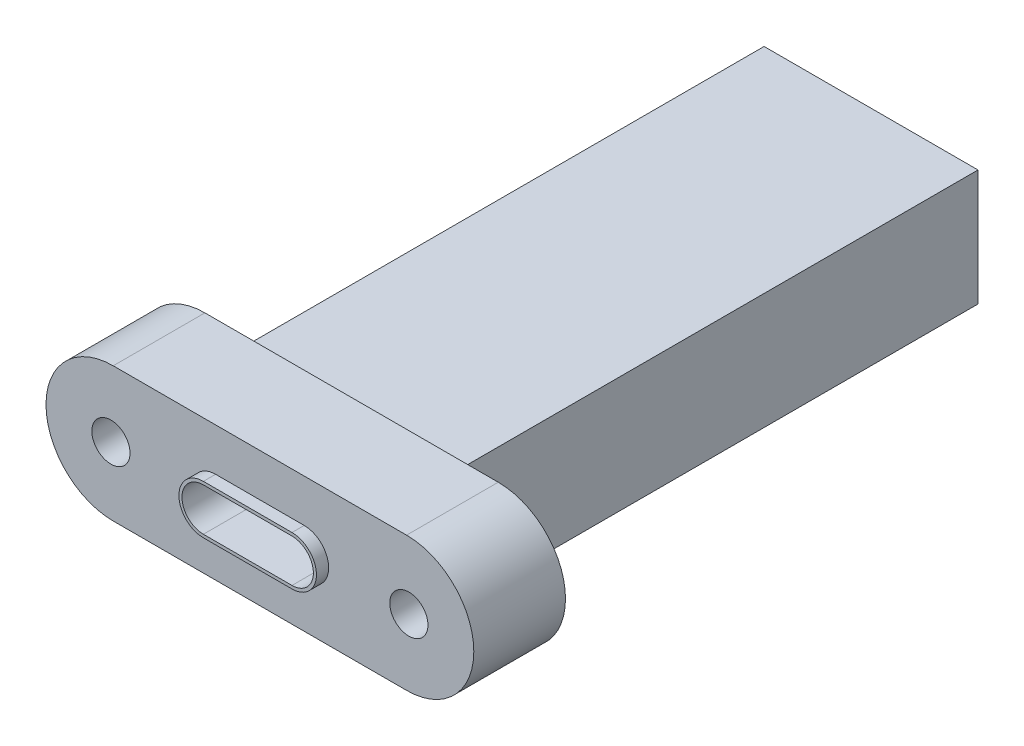
ISO-10303-21;
HEADER;
FILE_DESCRIPTION(('STEP AP214'),'2;1');
FILE_NAME('part.step','',(''),(''),'','','');
FILE_SCHEMA(('AUTOMOTIVE_DESIGN { 1 0 10303 214 1 1 1 1 }'));
ENDSEC;
DATA;
#1=APPLICATION_CONTEXT('core data for automotive mechanical design processes');
#2=APPLICATION_PROTOCOL_DEFINITION('international standard','automotive_design',2000,#1);
#3=PRODUCT_CONTEXT('',#1,'mechanical');
#4=PRODUCT('Part','Part','',(#3));
#5=PRODUCT_RELATED_PRODUCT_CATEGORY('part','',(#4));
#6=PRODUCT_DEFINITION_FORMATION('','',#4);
#7=PRODUCT_DEFINITION_CONTEXT('part definition',#1,'design');
#8=PRODUCT_DEFINITION('design','',#6,#7);
#9=PRODUCT_DEFINITION_SHAPE('','',#8);
#10=(LENGTH_UNIT() NAMED_UNIT(*) SI_UNIT(.MILLI.,.METRE.));
#11=(NAMED_UNIT(*) PLANE_ANGLE_UNIT() SI_UNIT($,.RADIAN.));
#12=(NAMED_UNIT(*) SI_UNIT($,.STERADIAN.) SOLID_ANGLE_UNIT());
#13=UNCERTAINTY_MEASURE_WITH_UNIT(LENGTH_MEASURE(1.E-05),#10,'distance_accuracy_value','');
#14=(GEOMETRIC_REPRESENTATION_CONTEXT(3) GLOBAL_UNCERTAINTY_ASSIGNED_CONTEXT((#13)) GLOBAL_UNIT_ASSIGNED_CONTEXT((#10,
#11,#12)) REPRESENTATION_CONTEXT('',''));
#15=CARTESIAN_POINT('',(0.,0.,0.));
#16=DIRECTION('',(0.,0.,1.));
#17=DIRECTION('',(1.,0.,0.));
#18=AXIS2_PLACEMENT_3D('',#15,#16,#17);
#19=CARTESIAN_POINT('',(-9.6,0.,40.));
#20=DIRECTION('',(0.,0.,1.));
#21=DIRECTION('',(1.,0.,0.));
#22=AXIS2_PLACEMENT_3D('',#19,#20,#21);
#23=PLANE('',#22);
#24=CARTESIAN_POINT('',(-9.75,0.,40.));
#25=DIRECTION('',(0.,0.,1.));
#26=DIRECTION('',(1.,0.,0.));
#27=AXIS2_PLACEMENT_3D('',#24,#25,#26);
#28=CIRCLE('',#27,1.24999999999999);
#29=CARTESIAN_POINT('',(-8.50000000000001,0.,40.));
#30=VERTEX_POINT('',#29);
#31=EDGE_CURVE('E285',#30,#30,#28,.T.);
#32=ORIENTED_EDGE('',*,*,#31,.F.);
#33=EDGE_LOOP('',(#32));
#34=FACE_BOUND('',#33,.T.);
#35=CARTESIAN_POINT('',(9.75,0.,40.));
#36=DIRECTION('',(0.,0.,1.));
#37=DIRECTION('',(1.,0.,0.));
#38=AXIS2_PLACEMENT_3D('',#35,#36,#37);
#39=CIRCLE('',#38,1.24999999999999);
#40=CARTESIAN_POINT('',(11.,0.,40.));
#41=VERTEX_POINT('',#40);
#42=EDGE_CURVE('E177',#41,#41,#39,.T.);
#43=ORIENTED_EDGE('',*,*,#42,.F.);
#44=EDGE_LOOP('',(#43));
#45=FACE_BOUND('',#44,.T.);
#46=CARTESIAN_POINT('',(-9.6,0.,40.));
#47=DIRECTION('',(0.,0.,1.));
#48=DIRECTION('',(1.,0.,0.));
#49=AXIS2_PLACEMENT_3D('',#46,#47,#48);
#50=CIRCLE('',#49,4.4);
#51=CARTESIAN_POINT('',(-9.6,4.4,40.));
#52=VERTEX_POINT('',#51);
#53=CARTESIAN_POINT('',(-9.6,-4.4,40.));
#54=VERTEX_POINT('',#53);
#55=EDGE_CURVE('E221',#52,#54,#50,.T.);
#56=ORIENTED_EDGE('',*,*,#55,.T.);
#57=DIRECTION('',(1.,0.,0.));
#58=VECTOR('',#57,1.);
#59=CARTESIAN_POINT('',(-9.6,-4.4,40.));
#60=LINE('',#59,#58);
#61=CARTESIAN_POINT('',(9.6,-4.4,40.));
#62=VERTEX_POINT('',#61);
#63=EDGE_CURVE('E224',#54,#62,#60,.T.);
#64=ORIENTED_EDGE('',*,*,#63,.T.);
#65=CARTESIAN_POINT('',(9.6,0.,40.));
#66=DIRECTION('',(0.,0.,1.));
#67=DIRECTION('',(1.,0.,0.));
#68=AXIS2_PLACEMENT_3D('',#65,#66,#67);
#69=CIRCLE('',#68,4.4);
#70=CARTESIAN_POINT('',(9.6,4.4,40.));
#71=VERTEX_POINT('',#70);
#72=EDGE_CURVE('E227',#62,#71,#69,.T.);
#73=ORIENTED_EDGE('',*,*,#72,.T.);
#74=DIRECTION('',(-1.,0.,0.));
#75=VECTOR('',#74,1.);
#76=CARTESIAN_POINT('',(-9.6,4.4,40.));
#77=LINE('',#76,#75);
#78=EDGE_CURVE('E229',#71,#52,#77,.T.);
#79=ORIENTED_EDGE('',*,*,#78,.T.);
#80=EDGE_LOOP('',(#56,#64,#73,#79));
#81=FACE_BOUND('',#80,.T.);
#82=DIRECTION('',(1.,0.,0.));
#83=VECTOR('',#82,1.);
#84=CARTESIAN_POINT('',(-2.9,-1.6,40.));
#85=LINE('',#84,#83);
#86=CARTESIAN_POINT('',(-2.9,-1.6,40.));
#87=VERTEX_POINT('',#86);
#88=CARTESIAN_POINT('',(2.9,-1.6,40.));
#89=VERTEX_POINT('',#88);
#90=EDGE_CURVE('E207',#87,#89,#85,.T.);
#91=ORIENTED_EDGE('',*,*,#90,.F.);
#92=CARTESIAN_POINT('',(-2.9,0.,40.));
#93=DIRECTION('',(0.,0.,1.));
#94=DIRECTION('',(1.,0.,0.));
#95=AXIS2_PLACEMENT_3D('',#92,#93,#94);
#96=CIRCLE('',#95,1.6);
#97=CARTESIAN_POINT('',(-2.9,1.6,40.));
#98=VERTEX_POINT('',#97);
#99=EDGE_CURVE('E190',#98,#87,#96,.T.);
#100=ORIENTED_EDGE('',*,*,#99,.F.);
#101=DIRECTION('',(-1.,0.,0.));
#102=VECTOR('',#101,1.);
#103=CARTESIAN_POINT('',(-2.9,1.6,40.));
#104=LINE('',#103,#102);
#105=CARTESIAN_POINT('',(2.9,1.6,40.));
#106=VERTEX_POINT('',#105);
#107=EDGE_CURVE('E198',#106,#98,#104,.T.);
#108=ORIENTED_EDGE('',*,*,#107,.F.);
#109=CARTESIAN_POINT('',(2.9,0.,40.));
#110=DIRECTION('',(0.,0.,1.));
#111=DIRECTION('',(1.,0.,0.));
#112=AXIS2_PLACEMENT_3D('',#109,#110,#111);
#113=CIRCLE('',#112,1.6);
#114=EDGE_CURVE('E209',#89,#106,#113,.T.);
#115=ORIENTED_EDGE('',*,*,#114,.F.);
#116=EDGE_LOOP('',(#91,#100,#108,#115));
#117=FACE_BOUND('',#116,.T.);
#118=ADVANCED_FACE('F35',(#34,#45,#81,#117),#23,.T.);
#119=CARTESIAN_POINT('',(7.,-3.8,34.));
#120=DIRECTION('',(-1.,0.,0.));
#121=DIRECTION('',(0.,0.,1.));
#122=AXIS2_PLACEMENT_3D('',#119,#120,#121);
#123=PLANE('',#122);
#124=DIRECTION('',(0.,1.,0.));
#125=VECTOR('',#124,1.);
#126=CARTESIAN_POINT('',(7.,-3.8,0.));
#127=LINE('',#126,#125);
#128=CARTESIAN_POINT('',(7.,-3.8,0.));
#129=VERTEX_POINT('',#128);
#130=CARTESIAN_POINT('',(7.,3.8,0.));
#131=VERTEX_POINT('',#130);
#132=EDGE_CURVE('E250',#129,#131,#127,.T.);
#133=ORIENTED_EDGE('',*,*,#132,.T.);
#134=DIRECTION('',(0.,0.,-1.));
#135=VECTOR('',#134,1.);
#136=CARTESIAN_POINT('',(7.,3.8,34.));
#137=LINE('',#136,#135);
#138=CARTESIAN_POINT('',(7.,3.8,34.));
#139=VERTEX_POINT('',#138);
#140=EDGE_CURVE('E11',#139,#131,#137,.T.);
#141=ORIENTED_EDGE('',*,*,#140,.F.);
#142=DIRECTION('',(0.,1.,0.));
#143=VECTOR('',#142,1.);
#144=CARTESIAN_POINT('',(7.,-3.8,34.));
#145=LINE('',#144,#143);
#146=CARTESIAN_POINT('',(7.,-3.8,34.));
#147=VERTEX_POINT('',#146);
#148=EDGE_CURVE('E251',#147,#139,#145,.T.);
#149=ORIENTED_EDGE('',*,*,#148,.F.);
#150=DIRECTION('',(0.,0.,-1.));
#151=VECTOR('',#150,1.);
#152=CARTESIAN_POINT('',(7.,-3.8,34.));
#153=LINE('',#152,#151);
#154=EDGE_CURVE('E264',#147,#129,#153,.T.);
#155=ORIENTED_EDGE('',*,*,#154,.T.);
#156=EDGE_LOOP('',(#133,#141,#149,#155));
#157=FACE_BOUND('',#156,.T.);
#158=ADVANCED_FACE('F37',(#157),#123,.F.);
#159=CARTESIAN_POINT('',(-7.,3.8,34.));
#160=DIRECTION('',(0.,-1.,0.));
#161=DIRECTION('',(0.,0.,-1.));
#162=AXIS2_PLACEMENT_3D('',#159,#160,#161);
#163=PLANE('',#162);
#164=DIRECTION('',(-1.,0.,0.));
#165=VECTOR('',#164,1.);
#166=CARTESIAN_POINT('',(-7.,3.8,0.));
#167=LINE('',#166,#165);
#168=CARTESIAN_POINT('',(-7.,3.8,0.));
#169=VERTEX_POINT('',#168);
#170=EDGE_CURVE('E267',#131,#169,#167,.T.);
#171=ORIENTED_EDGE('',*,*,#170,.T.);
#172=DIRECTION('',(0.,0.,-1.));
#173=VECTOR('',#172,1.);
#174=CARTESIAN_POINT('',(-7.,3.8,34.));
#175=LINE('',#174,#173);
#176=CARTESIAN_POINT('',(-7.,3.8,34.));
#177=VERTEX_POINT('',#176);
#178=EDGE_CURVE('E44',#177,#169,#175,.T.);
#179=ORIENTED_EDGE('',*,*,#178,.F.);
#180=DIRECTION('',(-1.,0.,0.));
#181=VECTOR('',#180,1.);
#182=CARTESIAN_POINT('',(-7.,3.8,34.));
#183=LINE('',#182,#181);
#184=EDGE_CURVE('E254',#139,#177,#183,.T.);
#185=ORIENTED_EDGE('',*,*,#184,.F.);
#186=ORIENTED_EDGE('',*,*,#140,.T.);
#187=EDGE_LOOP('',(#171,#179,#185,#186));
#188=FACE_BOUND('',#187,.T.);
#189=ADVANCED_FACE('F363',(#188),#163,.F.);
#190=CARTESIAN_POINT('',(-7.,-3.8,34.));
#191=DIRECTION('',(1.,0.,0.));
#192=DIRECTION('',(0.,0.,-1.));
#193=AXIS2_PLACEMENT_3D('',#190,#191,#192);
#194=PLANE('',#193);
#195=DIRECTION('',(0.,-1.,0.));
#196=VECTOR('',#195,1.);
#197=CARTESIAN_POINT('',(-7.,-3.8,0.));
#198=LINE('',#197,#196);
#199=CARTESIAN_POINT('',(-7.,-3.8,0.));
#200=VERTEX_POINT('',#199);
#201=EDGE_CURVE('E269',#169,#200,#198,.T.);
#202=ORIENTED_EDGE('',*,*,#201,.T.);
#203=DIRECTION('',(0.,0.,-1.));
#204=VECTOR('',#203,1.);
#205=CARTESIAN_POINT('',(-7.,-3.8,34.));
#206=LINE('',#205,#204);
#207=CARTESIAN_POINT('',(-7.,-3.8,34.));
#208=VERTEX_POINT('',#207);
#209=EDGE_CURVE('E274',#208,#200,#206,.T.);
#210=ORIENTED_EDGE('',*,*,#209,.F.);
#211=DIRECTION('',(0.,-1.,0.));
#212=VECTOR('',#211,1.);
#213=CARTESIAN_POINT('',(-7.,-3.8,34.));
#214=LINE('',#213,#212);
#215=EDGE_CURVE('E258',#177,#208,#214,.T.);
#216=ORIENTED_EDGE('',*,*,#215,.F.);
#217=ORIENTED_EDGE('',*,*,#178,.T.);
#218=EDGE_LOOP('',(#202,#210,#216,#217));
#219=FACE_BOUND('',#218,.T.);
#220=ADVANCED_FACE('F360',(#219),#194,.F.);
#221=CARTESIAN_POINT('',(-7.,-3.8,34.));
#222=DIRECTION('',(0.,1.,0.));
#223=DIRECTION('',(0.,0.,1.));
#224=AXIS2_PLACEMENT_3D('',#221,#222,#223);
#225=PLANE('',#224);
#226=DIRECTION('',(1.,0.,0.));
#227=VECTOR('',#226,1.);
#228=CARTESIAN_POINT('',(-7.,-3.8,0.));
#229=LINE('',#228,#227);
#230=EDGE_CURVE('E255',#200,#129,#229,.T.);
#231=ORIENTED_EDGE('',*,*,#230,.T.);
#232=ORIENTED_EDGE('',*,*,#154,.F.);
#233=DIRECTION('',(1.,0.,0.));
#234=VECTOR('',#233,1.);
#235=CARTESIAN_POINT('',(-7.,-3.8,34.));
#236=LINE('',#235,#234);
#237=EDGE_CURVE('E261',#208,#147,#236,.T.);
#238=ORIENTED_EDGE('',*,*,#237,.F.);
#239=ORIENTED_EDGE('',*,*,#209,.T.);
#240=EDGE_LOOP('',(#231,#232,#238,#239));
#241=FACE_BOUND('',#240,.T.);
#242=ADVANCED_FACE('F356',(#241),#225,.F.);
#243=CARTESIAN_POINT('',(0.,0.,0.));
#244=DIRECTION('',(0.,0.,-1.));
#245=DIRECTION('',(-1.,0.,0.));
#246=AXIS2_PLACEMENT_3D('',#243,#244,#245);
#247=PLANE('',#246);
#248=ORIENTED_EDGE('',*,*,#132,.F.);
#249=ORIENTED_EDGE('',*,*,#230,.F.);
#250=ORIENTED_EDGE('',*,*,#201,.F.);
#251=ORIENTED_EDGE('',*,*,#170,.F.);
#252=EDGE_LOOP('',(#248,#249,#250,#251));
#253=FACE_BOUND('',#252,.T.);
#254=ADVANCED_FACE('F339',(#253),#247,.T.);
#255=CARTESIAN_POINT('',(-9.6,0.,34.));
#256=DIRECTION('',(0.,0.,1.));
#257=DIRECTION('',(1.,0.,0.));
#258=AXIS2_PLACEMENT_3D('',#255,#256,#257);
#259=PLANE('',#258);
#260=CARTESIAN_POINT('',(-9.75,0.,34.));
#261=DIRECTION('',(0.,0.,1.));
#262=DIRECTION('',(1.,0.,0.));
#263=AXIS2_PLACEMENT_3D('',#260,#261,#262);
#264=CIRCLE('',#263,1.24999999999999);
#265=CARTESIAN_POINT('',(-8.50000000000001,0.,34.));
#266=VERTEX_POINT('',#265);
#267=EDGE_CURVE('E39',#266,#266,#264,.T.);
#268=ORIENTED_EDGE('',*,*,#267,.T.);
#269=EDGE_LOOP('',(#268));
#270=FACE_BOUND('',#269,.T.);
#271=CARTESIAN_POINT('',(9.75,0.,34.));
#272=DIRECTION('',(0.,0.,1.));
#273=DIRECTION('',(1.,0.,0.));
#274=AXIS2_PLACEMENT_3D('',#271,#272,#273);
#275=CIRCLE('',#274,1.24999999999999);
#276=CARTESIAN_POINT('',(11.,0.,34.));
#277=VERTEX_POINT('',#276);
#278=EDGE_CURVE('E184',#277,#277,#275,.T.);
#279=ORIENTED_EDGE('',*,*,#278,.T.);
#280=EDGE_LOOP('',(#279));
#281=FACE_BOUND('',#280,.T.);
#282=CARTESIAN_POINT('',(-9.6,0.,34.));
#283=DIRECTION('',(0.,0.,1.));
#284=DIRECTION('',(1.,0.,0.));
#285=AXIS2_PLACEMENT_3D('',#282,#283,#284);
#286=CIRCLE('',#285,4.4);
#287=CARTESIAN_POINT('',(-9.6,4.4,34.));
#288=VERTEX_POINT('',#287);
#289=CARTESIAN_POINT('',(-9.6,-4.4,34.));
#290=VERTEX_POINT('',#289);
#291=EDGE_CURVE('E220',#288,#290,#286,.T.);
#292=ORIENTED_EDGE('',*,*,#291,.F.);
#293=DIRECTION('',(-1.,0.,0.));
#294=VECTOR('',#293,1.);
#295=CARTESIAN_POINT('',(-9.6,4.4,34.));
#296=LINE('',#295,#294);
#297=CARTESIAN_POINT('',(9.6,4.4,34.));
#298=VERTEX_POINT('',#297);
#299=EDGE_CURVE('E225',#298,#288,#296,.T.);
#300=ORIENTED_EDGE('',*,*,#299,.F.);
#301=CARTESIAN_POINT('',(9.6,0.,34.));
#302=DIRECTION('',(0.,0.,1.));
#303=DIRECTION('',(1.,0.,0.));
#304=AXIS2_PLACEMENT_3D('',#301,#302,#303);
#305=CIRCLE('',#304,4.4);
#306=CARTESIAN_POINT('',(9.6,-4.4,34.));
#307=VERTEX_POINT('',#306);
#308=EDGE_CURVE('E236',#307,#298,#305,.T.);
#309=ORIENTED_EDGE('',*,*,#308,.F.);
#310=DIRECTION('',(1.,0.,0.));
#311=VECTOR('',#310,1.);
#312=CARTESIAN_POINT('',(-9.6,-4.4,34.));
#313=LINE('',#312,#311);
#314=EDGE_CURVE('E234',#290,#307,#313,.T.);
#315=ORIENTED_EDGE('',*,*,#314,.F.);
#316=EDGE_LOOP('',(#292,#300,#309,#315));
#317=FACE_BOUND('',#316,.T.);
#318=ORIENTED_EDGE('',*,*,#237,.T.);
#319=ORIENTED_EDGE('',*,*,#148,.T.);
#320=ORIENTED_EDGE('',*,*,#184,.T.);
#321=ORIENTED_EDGE('',*,*,#215,.T.);
#322=EDGE_LOOP('',(#318,#319,#320,#321));
#323=FACE_BOUND('',#322,.T.);
#324=ADVANCED_FACE('F335',(#270,#281,#317,#323),#259,.F.);
#325=CARTESIAN_POINT('',(-9.6,0.,40.));
#326=DIRECTION('',(0.,0.,-1.));
#327=DIRECTION('',(-1.,0.,0.));
#328=AXIS2_PLACEMENT_3D('',#325,#326,#327);
#329=CYLINDRICAL_SURFACE('',#328,4.4);
#330=ORIENTED_EDGE('',*,*,#291,.T.);
#331=DIRECTION('',(0.,0.,-1.));
#332=VECTOR('',#331,1.);
#333=CARTESIAN_POINT('',(-9.6,-4.4,40.));
#334=LINE('',#333,#332);
#335=EDGE_CURVE('E247',#54,#290,#334,.T.);
#336=ORIENTED_EDGE('',*,*,#335,.F.);
#337=ORIENTED_EDGE('',*,*,#55,.F.);
#338=DIRECTION('',(0.,0.,-1.));
#339=VECTOR('',#338,1.);
#340=CARTESIAN_POINT('',(-9.6,4.4,40.));
#341=LINE('',#340,#339);
#342=EDGE_CURVE('E231',#52,#288,#341,.T.);
#343=ORIENTED_EDGE('',*,*,#342,.T.);
#344=EDGE_LOOP('',(#330,#336,#337,#343));
#345=FACE_BOUND('',#344,.T.);
#346=ADVANCED_FACE('F338',(#345),#329,.T.);
#347=CARTESIAN_POINT('',(-9.6,-4.4,40.));
#348=DIRECTION('',(0.,1.,0.));
#349=DIRECTION('',(0.,0.,1.));
#350=AXIS2_PLACEMENT_3D('',#347,#348,#349);
#351=PLANE('',#350);
#352=ORIENTED_EDGE('',*,*,#314,.T.);
#353=DIRECTION('',(0.,0.,-1.));
#354=VECTOR('',#353,1.);
#355=CARTESIAN_POINT('',(9.6,-4.4,40.));
#356=LINE('',#355,#354);
#357=EDGE_CURVE('E244',#62,#307,#356,.T.);
#358=ORIENTED_EDGE('',*,*,#357,.F.);
#359=ORIENTED_EDGE('',*,*,#63,.F.);
#360=ORIENTED_EDGE('',*,*,#335,.T.);
#361=EDGE_LOOP('',(#352,#358,#359,#360));
#362=FACE_BOUND('',#361,.T.);
#363=ADVANCED_FACE('F346',(#362),#351,.F.);
#364=CARTESIAN_POINT('',(9.6,0.,40.));
#365=DIRECTION('',(0.,0.,-1.));
#366=DIRECTION('',(-1.,0.,0.));
#367=AXIS2_PLACEMENT_3D('',#364,#365,#366);
#368=CYLINDRICAL_SURFACE('',#367,4.4);
#369=ORIENTED_EDGE('',*,*,#308,.T.);
#370=DIRECTION('',(0.,0.,-1.));
#371=VECTOR('',#370,1.);
#372=CARTESIAN_POINT('',(9.6,4.4,40.));
#373=LINE('',#372,#371);
#374=EDGE_CURVE('E241',#71,#298,#373,.T.);
#375=ORIENTED_EDGE('',*,*,#374,.F.);
#376=ORIENTED_EDGE('',*,*,#72,.F.);
#377=ORIENTED_EDGE('',*,*,#357,.T.);
#378=EDGE_LOOP('',(#369,#375,#376,#377));
#379=FACE_BOUND('',#378,.T.);
#380=ADVANCED_FACE('F342',(#379),#368,.T.);
#381=CARTESIAN_POINT('',(-9.6,4.4,40.));
#382=DIRECTION('',(0.,-1.,0.));
#383=DIRECTION('',(0.,0.,-1.));
#384=AXIS2_PLACEMENT_3D('',#381,#382,#383);
#385=PLANE('',#384);
#386=ORIENTED_EDGE('',*,*,#299,.T.);
#387=ORIENTED_EDGE('',*,*,#342,.F.);
#388=ORIENTED_EDGE('',*,*,#78,.F.);
#389=ORIENTED_EDGE('',*,*,#374,.T.);
#390=EDGE_LOOP('',(#386,#387,#388,#389));
#391=FACE_BOUND('',#390,.T.);
#392=ADVANCED_FACE('F333',(#391),#385,.F.);
#393=CARTESIAN_POINT('',(-2.9,0.,40.8));
#394=DIRECTION('',(0.,0.,-1.));
#395=DIRECTION('',(-1.,0.,0.));
#396=AXIS2_PLACEMENT_3D('',#393,#394,#395);
#397=CYLINDRICAL_SURFACE('',#396,1.6);
#398=ORIENTED_EDGE('',*,*,#99,.T.);
#399=DIRECTION('',(0.,0.,-1.));
#400=VECTOR('',#399,1.);
#401=CARTESIAN_POINT('',(-2.9,-1.6,40.8));
#402=LINE('',#401,#400);
#403=CARTESIAN_POINT('',(-2.9,-1.6,40.8));
#404=VERTEX_POINT('',#403);
#405=EDGE_CURVE('E218',#404,#87,#402,.T.);
#406=ORIENTED_EDGE('',*,*,#405,.F.);
#407=CARTESIAN_POINT('',(-2.9,0.,40.8));
#408=DIRECTION('',(0.,0.,1.));
#409=DIRECTION('',(1.,0.,0.));
#410=AXIS2_PLACEMENT_3D('',#407,#408,#409);
#411=CIRCLE('',#410,1.6);
#412=CARTESIAN_POINT('',(-2.9,1.6,40.8));
#413=VERTEX_POINT('',#412);
#414=EDGE_CURVE('E194',#413,#404,#411,.T.);
#415=ORIENTED_EDGE('',*,*,#414,.F.);
#416=DIRECTION('',(0.,0.,-1.));
#417=VECTOR('',#416,1.);
#418=CARTESIAN_POINT('',(-2.9,1.6,40.8));
#419=LINE('',#418,#417);
#420=EDGE_CURVE('E204',#413,#98,#419,.T.);
#421=ORIENTED_EDGE('',*,*,#420,.T.);
#422=EDGE_LOOP('',(#398,#406,#415,#421));
#423=FACE_BOUND('',#422,.T.);
#424=ADVANCED_FACE('F317',(#423),#397,.T.);
#425=CARTESIAN_POINT('',(-2.9,-1.6,40.8));
#426=DIRECTION('',(0.,1.,0.));
#427=DIRECTION('',(0.,0.,1.));
#428=AXIS2_PLACEMENT_3D('',#425,#426,#427);
#429=PLANE('',#428);
#430=ORIENTED_EDGE('',*,*,#90,.T.);
#431=DIRECTION('',(0.,0.,-1.));
#432=VECTOR('',#431,1.);
#433=CARTESIAN_POINT('',(2.9,-1.6,40.8));
#434=LINE('',#433,#432);
#435=CARTESIAN_POINT('',(2.9,-1.6,40.8));
#436=VERTEX_POINT('',#435);
#437=EDGE_CURVE('E215',#436,#89,#434,.T.);
#438=ORIENTED_EDGE('',*,*,#437,.F.);
#439=DIRECTION('',(1.,0.,0.));
#440=VECTOR('',#439,1.);
#441=CARTESIAN_POINT('',(-2.9,-1.6,40.8));
#442=LINE('',#441,#440);
#443=EDGE_CURVE('E197',#404,#436,#442,.T.);
#444=ORIENTED_EDGE('',*,*,#443,.F.);
#445=ORIENTED_EDGE('',*,*,#405,.T.);
#446=EDGE_LOOP('',(#430,#438,#444,#445));
#447=FACE_BOUND('',#446,.T.);
#448=ADVANCED_FACE('F307',(#447),#429,.F.);
#449=CARTESIAN_POINT('',(2.9,0.,40.8));
#450=DIRECTION('',(0.,0.,-1.));
#451=DIRECTION('',(-1.,0.,0.));
#452=AXIS2_PLACEMENT_3D('',#449,#450,#451);
#453=CYLINDRICAL_SURFACE('',#452,1.6);
#454=ORIENTED_EDGE('',*,*,#114,.T.);
#455=DIRECTION('',(0.,0.,-1.));
#456=VECTOR('',#455,1.);
#457=CARTESIAN_POINT('',(2.9,1.6,40.8));
#458=LINE('',#457,#456);
#459=CARTESIAN_POINT('',(2.9,1.6,40.8));
#460=VERTEX_POINT('',#459);
#461=EDGE_CURVE('E60',#460,#106,#458,.T.);
#462=ORIENTED_EDGE('',*,*,#461,.F.);
#463=CARTESIAN_POINT('',(2.9,0.,40.8));
#464=DIRECTION('',(0.,0.,1.));
#465=DIRECTION('',(1.,0.,0.));
#466=AXIS2_PLACEMENT_3D('',#463,#464,#465);
#467=CIRCLE('',#466,1.6);
#468=EDGE_CURVE('E200',#436,#460,#467,.T.);
#469=ORIENTED_EDGE('',*,*,#468,.F.);
#470=ORIENTED_EDGE('',*,*,#437,.T.);
#471=EDGE_LOOP('',(#454,#462,#469,#470));
#472=FACE_BOUND('',#471,.T.);
#473=ADVANCED_FACE('F311',(#472),#453,.T.);
#474=CARTESIAN_POINT('',(-2.9,1.6,40.8));
#475=DIRECTION('',(0.,-1.,0.));
#476=DIRECTION('',(0.,0.,-1.));
#477=AXIS2_PLACEMENT_3D('',#474,#475,#476);
#478=PLANE('',#477);
#479=ORIENTED_EDGE('',*,*,#107,.T.);
#480=ORIENTED_EDGE('',*,*,#420,.F.);
#481=DIRECTION('',(-1.,0.,0.));
#482=VECTOR('',#481,1.);
#483=CARTESIAN_POINT('',(-2.9,1.6,40.8));
#484=LINE('',#483,#482);
#485=EDGE_CURVE('E202',#460,#413,#484,.T.);
#486=ORIENTED_EDGE('',*,*,#485,.F.);
#487=ORIENTED_EDGE('',*,*,#461,.T.);
#488=EDGE_LOOP('',(#479,#480,#486,#487));
#489=FACE_BOUND('',#488,.T.);
#490=ADVANCED_FACE('F318',(#489),#478,.F.);
#491=CARTESIAN_POINT('',(-2.9,0.,40.8));
#492=DIRECTION('',(0.,0.,1.));
#493=DIRECTION('',(1.,0.,0.));
#494=AXIS2_PLACEMENT_3D('',#491,#492,#493);
#495=PLANE('',#494);
#496=CARTESIAN_POINT('',(-2.9,0.,40.8));
#497=DIRECTION('',(0.,0.,1.));
#498=DIRECTION('',(1.,0.,0.));
#499=AXIS2_PLACEMENT_3D('',#496,#497,#498);
#500=CIRCLE('',#499,1.4);
#501=CARTESIAN_POINT('',(-2.9,1.4,40.8));
#502=VERTEX_POINT('',#501);
#503=CARTESIAN_POINT('',(-2.9,-1.4,40.8));
#504=VERTEX_POINT('',#503);
#505=EDGE_CURVE('E52',#502,#504,#500,.T.);
#506=ORIENTED_EDGE('',*,*,#505,.F.);
#507=DIRECTION('',(-1.,0.,0.));
#508=VECTOR('',#507,1.);
#509=CARTESIAN_POINT('',(2.9,1.4,40.8));
#510=LINE('',#509,#508);
#511=CARTESIAN_POINT('',(2.9,1.4,40.8));
#512=VERTEX_POINT('',#511);
#513=EDGE_CURVE('E171',#512,#502,#510,.T.);
#514=ORIENTED_EDGE('',*,*,#513,.F.);
#515=CARTESIAN_POINT('',(2.9,0.,40.8));
#516=DIRECTION('',(0.,0.,1.));
#517=DIRECTION('',(1.,0.,0.));
#518=AXIS2_PLACEMENT_3D('',#515,#516,#517);
#519=CIRCLE('',#518,1.4);
#520=CARTESIAN_POINT('',(2.9,-1.4,40.8));
#521=VERTEX_POINT('',#520);
#522=EDGE_CURVE('E174',#521,#512,#519,.T.);
#523=ORIENTED_EDGE('',*,*,#522,.F.);
#524=DIRECTION('',(1.,0.,0.));
#525=VECTOR('',#524,1.);
#526=CARTESIAN_POINT('',(-2.9,-1.4,40.8));
#527=LINE('',#526,#525);
#528=EDGE_CURVE('E183',#504,#521,#527,.T.);
#529=ORIENTED_EDGE('',*,*,#528,.F.);
#530=EDGE_LOOP('',(#506,#514,#523,#529));
#531=FACE_BOUND('',#530,.T.);
#532=ORIENTED_EDGE('',*,*,#414,.T.);
#533=ORIENTED_EDGE('',*,*,#443,.T.);
#534=ORIENTED_EDGE('',*,*,#468,.T.);
#535=ORIENTED_EDGE('',*,*,#485,.T.);
#536=EDGE_LOOP('',(#532,#533,#534,#535));
#537=FACE_BOUND('',#536,.T.);
#538=ADVANCED_FACE('F313',(#531,#537),#495,.T.);
#539=CARTESIAN_POINT('',(-2.9,0.,35.8));
#540=DIRECTION('',(0.,0.,1.));
#541=DIRECTION('',(1.,0.,0.));
#542=AXIS2_PLACEMENT_3D('',#539,#540,#541);
#543=CYLINDRICAL_SURFACE('',#542,1.4);
#544=ORIENTED_EDGE('',*,*,#505,.T.);
#545=DIRECTION('',(0.,0.,1.));
#546=VECTOR('',#545,1.);
#547=CARTESIAN_POINT('',(-2.9,-1.4,35.8));
#548=LINE('',#547,#546);
#549=CARTESIAN_POINT('',(-2.9,-1.4,35.8));
#550=VERTEX_POINT('',#549);
#551=EDGE_CURVE('E149',#550,#504,#548,.T.);
#552=ORIENTED_EDGE('',*,*,#551,.F.);
#553=CARTESIAN_POINT('',(-2.9,0.,35.8));
#554=DIRECTION('',(0.,0.,1.));
#555=DIRECTION('',(1.,0.,0.));
#556=AXIS2_PLACEMENT_3D('',#553,#554,#555);
#557=CIRCLE('',#556,1.4);
#558=CARTESIAN_POINT('',(-2.9,1.4,35.8));
#559=VERTEX_POINT('',#558);
#560=EDGE_CURVE('E153',#559,#550,#557,.T.);
#561=ORIENTED_EDGE('',*,*,#560,.F.);
#562=DIRECTION('',(0.,0.,1.));
#563=VECTOR('',#562,1.);
#564=CARTESIAN_POINT('',(-2.9,1.4,35.8));
#565=LINE('',#564,#563);
#566=EDGE_CURVE('E188',#559,#502,#565,.T.);
#567=ORIENTED_EDGE('',*,*,#566,.T.);
#568=EDGE_LOOP('',(#544,#552,#561,#567));
#569=FACE_BOUND('',#568,.T.);
#570=ADVANCED_FACE('F151',(#569),#543,.F.);
#571=CARTESIAN_POINT('',(2.9,1.4,35.8));
#572=DIRECTION('',(0.,1.,0.));
#573=DIRECTION('',(-1.,0.,0.));
#574=AXIS2_PLACEMENT_3D('',#571,#572,#573);
#575=PLANE('',#574);
#576=ORIENTED_EDGE('',*,*,#513,.T.);
#577=ORIENTED_EDGE('',*,*,#566,.F.);
#578=DIRECTION('',(-1.,0.,0.));
#579=VECTOR('',#578,1.);
#580=CARTESIAN_POINT('',(2.9,1.4,35.8));
#581=LINE('',#580,#579);
#582=CARTESIAN_POINT('',(2.9,1.4,35.8));
#583=VERTEX_POINT('',#582);
#584=EDGE_CURVE('E159',#583,#559,#581,.T.);
#585=ORIENTED_EDGE('',*,*,#584,.F.);
#586=DIRECTION('',(0.,0.,1.));
#587=VECTOR('',#586,1.);
#588=CARTESIAN_POINT('',(2.9,1.4,35.8));
#589=LINE('',#588,#587);
#590=EDGE_CURVE('E191',#583,#512,#589,.T.);
#591=ORIENTED_EDGE('',*,*,#590,.T.);
#592=EDGE_LOOP('',(#576,#577,#585,#591));
#593=FACE_BOUND('',#592,.T.);
#594=ADVANCED_FACE('F438',(#593),#575,.F.);
#595=CARTESIAN_POINT('',(2.9,0.,35.8));
#596=DIRECTION('',(0.,0.,1.));
#597=DIRECTION('',(1.,0.,0.));
#598=AXIS2_PLACEMENT_3D('',#595,#596,#597);
#599=CYLINDRICAL_SURFACE('',#598,1.4);
#600=ORIENTED_EDGE('',*,*,#522,.T.);
#601=ORIENTED_EDGE('',*,*,#590,.F.);
#602=CARTESIAN_POINT('',(2.9,0.,35.8));
#603=DIRECTION('',(0.,0.,1.));
#604=DIRECTION('',(1.,0.,0.));
#605=AXIS2_PLACEMENT_3D('',#602,#603,#604);
#606=CIRCLE('',#605,1.4);
#607=CARTESIAN_POINT('',(2.9,-1.4,35.8));
#608=VERTEX_POINT('',#607);
#609=EDGE_CURVE('E167',#608,#583,#606,.T.);
#610=ORIENTED_EDGE('',*,*,#609,.F.);
#611=DIRECTION('',(0.,0.,1.));
#612=VECTOR('',#611,1.);
#613=CARTESIAN_POINT('',(2.9,-1.4,35.8));
#614=LINE('',#613,#612);
#615=EDGE_CURVE('E158',#608,#521,#614,.T.);
#616=ORIENTED_EDGE('',*,*,#615,.T.);
#617=EDGE_LOOP('',(#600,#601,#610,#616));
#618=FACE_BOUND('',#617,.T.);
#619=ADVANCED_FACE('F431',(#618),#599,.F.);
#620=CARTESIAN_POINT('',(-2.9,-1.4,35.8));
#621=DIRECTION('',(0.,-1.,0.));
#622=DIRECTION('',(1.,0.,0.));
#623=AXIS2_PLACEMENT_3D('',#620,#621,#622);
#624=PLANE('',#623);
#625=ORIENTED_EDGE('',*,*,#528,.T.);
#626=ORIENTED_EDGE('',*,*,#615,.F.);
#627=DIRECTION('',(1.,0.,0.));
#628=VECTOR('',#627,1.);
#629=CARTESIAN_POINT('',(-2.9,-1.4,35.8));
#630=LINE('',#629,#628);
#631=EDGE_CURVE('E162',#550,#608,#630,.T.);
#632=ORIENTED_EDGE('',*,*,#631,.F.);
#633=ORIENTED_EDGE('',*,*,#551,.T.);
#634=EDGE_LOOP('',(#625,#626,#632,#633));
#635=FACE_BOUND('',#634,.T.);
#636=ADVANCED_FACE('F163',(#635),#624,.F.);
#637=CARTESIAN_POINT('',(-2.9,0.,35.8));
#638=DIRECTION('',(0.,0.,1.));
#639=DIRECTION('',(1.,0.,0.));
#640=AXIS2_PLACEMENT_3D('',#637,#638,#639);
#641=PLANE('',#640);
#642=ORIENTED_EDGE('',*,*,#560,.T.);
#643=ORIENTED_EDGE('',*,*,#631,.T.);
#644=ORIENTED_EDGE('',*,*,#609,.T.);
#645=ORIENTED_EDGE('',*,*,#584,.T.);
#646=EDGE_LOOP('',(#642,#643,#644,#645));
#647=FACE_BOUND('',#646,.T.);
#648=ADVANCED_FACE('F169',(#647),#641,.T.);
#649=CARTESIAN_POINT('',(9.75,0.,40.));
#650=DIRECTION('',(0.,0.,1.));
#651=DIRECTION('',(1.,0.,0.));
#652=AXIS2_PLACEMENT_3D('',#649,#650,#651);
#653=CYLINDRICAL_SURFACE('',#652,1.24999999999999);
#654=ORIENTED_EDGE('',*,*,#42,.T.);
#655=EDGE_LOOP('',(#654));
#656=FACE_BOUND('',#655,.T.);
#657=ORIENTED_EDGE('',*,*,#278,.F.);
#658=EDGE_LOOP('',(#657));
#659=FACE_BOUND('',#658,.T.);
#660=ADVANCED_FACE('F406',(#656,#659),#653,.F.);
#661=CARTESIAN_POINT('',(-9.75,0.,40.));
#662=DIRECTION('',(0.,0.,1.));
#663=DIRECTION('',(1.,0.,0.));
#664=AXIS2_PLACEMENT_3D('',#661,#662,#663);
#665=CYLINDRICAL_SURFACE('',#664,1.24999999999999);
#666=ORIENTED_EDGE('',*,*,#31,.T.);
#667=EDGE_LOOP('',(#666));
#668=FACE_BOUND('',#667,.T.);
#669=ORIENTED_EDGE('',*,*,#267,.F.);
#670=EDGE_LOOP('',(#669));
#671=FACE_BOUND('',#670,.T.);
#672=ADVANCED_FACE('F291',(#668,#671),#665,.F.);
#673=CLOSED_SHELL('',(#118,#158,#189,#220,#242,#254,#324,#346,#363,#380,#392,#424,#448,#473,
#490,#538,#570,#594,#619,#636,#648,#660,#672));
#674=MANIFOLD_SOLID_BREP('B2',#673);
#675=ADVANCED_BREP_SHAPE_REPRESENTATION('',(#18,#674),#14);
#676=SHAPE_DEFINITION_REPRESENTATION(#9,#675);
ENDSEC;
END-ISO-10303-21;
